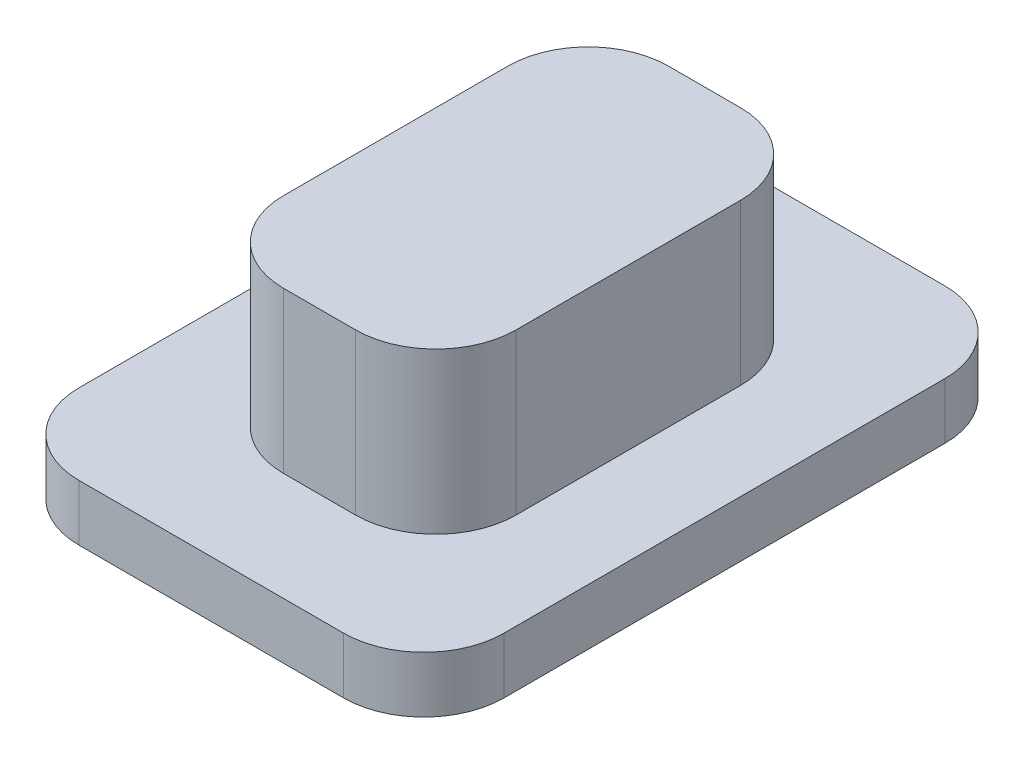
ISO-10303-21;
HEADER;
FILE_DESCRIPTION(('STEP AP214'),'2;1');
FILE_NAME('part.step','',(''),(''),'','','');
FILE_SCHEMA(('AUTOMOTIVE_DESIGN { 1 0 10303 214 1 1 1 1 }'));
ENDSEC;
DATA;
#1=APPLICATION_CONTEXT('core data for automotive mechanical design processes');
#2=APPLICATION_PROTOCOL_DEFINITION('international standard','automotive_design',2000,#1);
#3=PRODUCT_CONTEXT('',#1,'mechanical');
#4=PRODUCT('Part','Part','',(#3));
#5=PRODUCT_RELATED_PRODUCT_CATEGORY('part','',(#4));
#6=PRODUCT_DEFINITION_FORMATION('','',#4);
#7=PRODUCT_DEFINITION_CONTEXT('part definition',#1,'design');
#8=PRODUCT_DEFINITION('design','',#6,#7);
#9=PRODUCT_DEFINITION_SHAPE('','',#8);
#10=(LENGTH_UNIT() NAMED_UNIT(*) SI_UNIT(.MILLI.,.METRE.));
#11=(NAMED_UNIT(*) PLANE_ANGLE_UNIT() SI_UNIT($,.RADIAN.));
#12=(NAMED_UNIT(*) SI_UNIT($,.STERADIAN.) SOLID_ANGLE_UNIT());
#13=UNCERTAINTY_MEASURE_WITH_UNIT(LENGTH_MEASURE(1.E-05),#10,'distance_accuracy_value','');
#14=(GEOMETRIC_REPRESENTATION_CONTEXT(3) GLOBAL_UNCERTAINTY_ASSIGNED_CONTEXT((#13)) GLOBAL_UNIT_ASSIGNED_CONTEXT((#10,
#11,#12)) REPRESENTATION_CONTEXT('',''));
#15=CARTESIAN_POINT('',(0.,0.,0.));
#16=DIRECTION('',(0.,0.,1.));
#17=DIRECTION('',(1.,0.,0.));
#18=AXIS2_PLACEMENT_3D('',#15,#16,#17);
#19=CARTESIAN_POINT('',(0.,0.7,-5.48303571428572));
#20=DIRECTION('',(0.,0.,-1.));
#21=DIRECTION('',(-1.,0.,0.));
#22=AXIS2_PLACEMENT_3D('',#19,#20,#21);
#23=PLANE('',#22);
#24=DIRECTION('',(1.,0.,0.));
#25=VECTOR('',#24,1.);
#26=CARTESIAN_POINT('',(0.,0.,-5.48303571428572));
#27=LINE('',#26,#25);
#28=CARTESIAN_POINT('',(-2.91666666666666,0.,-5.48303571428572));
#29=VERTEX_POINT('',#28);
#30=CARTESIAN_POINT('',(0.383333333333336,0.,-5.48303571428572));
#31=VERTEX_POINT('',#30);
#32=EDGE_CURVE('E147',#29,#31,#27,.T.);
#33=ORIENTED_EDGE('',*,*,#32,.F.);
#34=DIRECTION('',(0.,-1.,0.));
#35=VECTOR('',#34,1.);
#36=CARTESIAN_POINT('',(-2.91666666666666,0.7,-5.48303571428572));
#37=LINE('',#36,#35);
#38=CARTESIAN_POINT('',(-2.91666666666666,0.7,-5.48303571428572));
#39=VERTEX_POINT('',#38);
#40=EDGE_CURVE('E11',#39,#29,#37,.T.);
#41=ORIENTED_EDGE('',*,*,#40,.F.);
#42=DIRECTION('',(1.,0.,0.));
#43=VECTOR('',#42,1.);
#44=CARTESIAN_POINT('',(0.,0.7,-5.48303571428572));
#45=LINE('',#44,#43);
#46=CARTESIAN_POINT('',(0.383333333333336,0.7,-5.48303571428572));
#47=VERTEX_POINT('',#46);
#48=EDGE_CURVE('E191',#39,#47,#45,.T.);
#49=ORIENTED_EDGE('',*,*,#48,.T.);
#50=DIRECTION('',(0.,-1.,0.));
#51=VECTOR('',#50,1.);
#52=CARTESIAN_POINT('',(0.383333333333336,0.7,-5.48303571428572));
#53=LINE('',#52,#51);
#54=EDGE_CURVE('E59',#47,#31,#53,.T.);
#55=ORIENTED_EDGE('',*,*,#54,.T.);
#56=EDGE_LOOP('',(#33,#41,#49,#55));
#57=FACE_BOUND('',#56,.T.);
#58=ADVANCED_FACE('F43',(#57),#23,.T.);
#59=CARTESIAN_POINT('',(-2.91666666666666,0.7,-4.48303571428572));
#60=DIRECTION('',(0.,-1.,0.));
#61=DIRECTION('',(0.,0.,-1.));
#62=AXIS2_PLACEMENT_3D('',#59,#60,#61);
#63=CYLINDRICAL_SURFACE('',#62,1.);
#64=CARTESIAN_POINT('',(-2.91666666666666,0.,-4.48303571428572));
#65=DIRECTION('',(0.,1.,0.));
#66=DIRECTION('',(0.,0.,1.));
#67=AXIS2_PLACEMENT_3D('',#64,#65,#66);
#68=CIRCLE('',#67,1.);
#69=CARTESIAN_POINT('',(-3.91666666666666,0.,-4.48303571428572));
#70=VERTEX_POINT('',#69);
#71=EDGE_CURVE('E149',#29,#70,#68,.T.);
#72=ORIENTED_EDGE('',*,*,#71,.T.);
#73=DIRECTION('',(0.,-1.,0.));
#74=VECTOR('',#73,1.);
#75=CARTESIAN_POINT('',(-3.91666666666666,0.7,-4.48303571428572));
#76=LINE('',#75,#74);
#77=CARTESIAN_POINT('',(-3.91666666666666,0.7,-4.48303571428572));
#78=VERTEX_POINT('',#77);
#79=EDGE_CURVE('E51',#78,#70,#76,.T.);
#80=ORIENTED_EDGE('',*,*,#79,.F.);
#81=CARTESIAN_POINT('',(-2.91666666666666,0.7,-4.48303571428572));
#82=DIRECTION('',(0.,1.,0.));
#83=DIRECTION('',(0.,0.,1.));
#84=AXIS2_PLACEMENT_3D('',#81,#82,#83);
#85=CIRCLE('',#84,1.);
#86=EDGE_CURVE('E192',#39,#78,#85,.T.);
#87=ORIENTED_EDGE('',*,*,#86,.F.);
#88=ORIENTED_EDGE('',*,*,#40,.T.);
#89=EDGE_LOOP('',(#72,#80,#87,#88));
#90=FACE_BOUND('',#89,.T.);
#91=ADVANCED_FACE('F188',(#90),#63,.T.);
#92=CARTESIAN_POINT('',(-3.91666666666666,0.7,0.));
#93=DIRECTION('',(1.,0.,0.));
#94=DIRECTION('',(0.,0.,-1.));
#95=AXIS2_PLACEMENT_3D('',#92,#93,#94);
#96=PLANE('',#95);
#97=DIRECTION('',(0.,0.,1.));
#98=VECTOR('',#97,1.);
#99=CARTESIAN_POINT('',(-3.91666666666666,0.,0.));
#100=LINE('',#99,#98);
#101=CARTESIAN_POINT('',(-3.91666666666666,0.,1.01696428571428));
#102=VERTEX_POINT('',#101);
#103=EDGE_CURVE('E153',#70,#102,#100,.T.);
#104=ORIENTED_EDGE('',*,*,#103,.T.);
#105=DIRECTION('',(0.,-1.,0.));
#106=VECTOR('',#105,1.);
#107=CARTESIAN_POINT('',(-3.91666666666666,0.7,1.01696428571428));
#108=LINE('',#107,#106);
#109=CARTESIAN_POINT('',(-3.91666666666666,0.7,1.01696428571428));
#110=VERTEX_POINT('',#109);
#111=EDGE_CURVE('E175',#110,#102,#108,.T.);
#112=ORIENTED_EDGE('',*,*,#111,.F.);
#113=DIRECTION('',(0.,0.,1.));
#114=VECTOR('',#113,1.);
#115=CARTESIAN_POINT('',(-3.91666666666666,0.7,0.));
#116=LINE('',#115,#114);
#117=EDGE_CURVE('E183',#78,#110,#116,.T.);
#118=ORIENTED_EDGE('',*,*,#117,.F.);
#119=ORIENTED_EDGE('',*,*,#79,.T.);
#120=EDGE_LOOP('',(#104,#112,#118,#119));
#121=FACE_BOUND('',#120,.T.);
#122=ADVANCED_FACE('F180',(#121),#96,.F.);
#123=CARTESIAN_POINT('',(-2.91666666666666,0.7,1.01696428571428));
#124=DIRECTION('',(0.,-1.,0.));
#125=DIRECTION('',(0.,0.,-1.));
#126=AXIS2_PLACEMENT_3D('',#123,#124,#125);
#127=CYLINDRICAL_SURFACE('',#126,1.);
#128=CARTESIAN_POINT('',(-2.91666666666666,0.,1.01696428571428));
#129=DIRECTION('',(0.,1.,0.));
#130=DIRECTION('',(0.,0.,1.));
#131=AXIS2_PLACEMENT_3D('',#128,#129,#130);
#132=CIRCLE('',#131,1.);
#133=CARTESIAN_POINT('',(-2.91666666666666,0.,2.01696428571428));
#134=VERTEX_POINT('',#133);
#135=EDGE_CURVE('E156',#102,#134,#132,.T.);
#136=ORIENTED_EDGE('',*,*,#135,.T.);
#137=DIRECTION('',(0.,-1.,0.));
#138=VECTOR('',#137,1.);
#139=CARTESIAN_POINT('',(-2.91666666666666,0.7,2.01696428571428));
#140=LINE('',#139,#138);
#141=CARTESIAN_POINT('',(-2.91666666666666,0.7,2.01696428571428));
#142=VERTEX_POINT('',#141);
#143=EDGE_CURVE('E172',#142,#134,#140,.T.);
#144=ORIENTED_EDGE('',*,*,#143,.F.);
#145=CARTESIAN_POINT('',(-2.91666666666666,0.7,1.01696428571428));
#146=DIRECTION('',(0.,1.,0.));
#147=DIRECTION('',(0.,0.,1.));
#148=AXIS2_PLACEMENT_3D('',#145,#146,#147);
#149=CIRCLE('',#148,1.);
#150=EDGE_CURVE('E202',#110,#142,#149,.T.);
#151=ORIENTED_EDGE('',*,*,#150,.F.);
#152=ORIENTED_EDGE('',*,*,#111,.T.);
#153=EDGE_LOOP('',(#136,#144,#151,#152));
#154=FACE_BOUND('',#153,.T.);
#155=ADVANCED_FACE('F205',(#154),#127,.T.);
#156=CARTESIAN_POINT('',(0.,0.7,2.01696428571428));
#157=DIRECTION('',(0.,0.,-1.));
#158=DIRECTION('',(-1.,0.,0.));
#159=AXIS2_PLACEMENT_3D('',#156,#157,#158);
#160=PLANE('',#159);
#161=DIRECTION('',(1.,0.,0.));
#162=VECTOR('',#161,1.);
#163=CARTESIAN_POINT('',(0.,0.,2.01696428571428));
#164=LINE('',#163,#162);
#165=CARTESIAN_POINT('',(0.383333333333338,0.,2.01696428571428));
#166=VERTEX_POINT('',#165);
#167=EDGE_CURVE('E159',#134,#166,#164,.T.);
#168=ORIENTED_EDGE('',*,*,#167,.T.);
#169=DIRECTION('',(0.,-1.,0.));
#170=VECTOR('',#169,1.);
#171=CARTESIAN_POINT('',(0.383333333333338,0.7,2.01696428571428));
#172=LINE('',#171,#170);
#173=CARTESIAN_POINT('',(0.383333333333338,0.7,2.01696428571428));
#174=VERTEX_POINT('',#173);
#175=EDGE_CURVE('E139',#174,#166,#172,.T.);
#176=ORIENTED_EDGE('',*,*,#175,.F.);
#177=DIRECTION('',(1.,0.,0.));
#178=VECTOR('',#177,1.);
#179=CARTESIAN_POINT('',(0.,0.7,2.01696428571428));
#180=LINE('',#179,#178);
#181=EDGE_CURVE('E128',#142,#174,#180,.T.);
#182=ORIENTED_EDGE('',*,*,#181,.F.);
#183=ORIENTED_EDGE('',*,*,#143,.T.);
#184=EDGE_LOOP('',(#168,#176,#182,#183));
#185=FACE_BOUND('',#184,.T.);
#186=ADVANCED_FACE('F207',(#185),#160,.F.);
#187=CARTESIAN_POINT('',(0.383333333333338,0.7,1.01696428571428));
#188=DIRECTION('',(0.,-1.,0.));
#189=DIRECTION('',(0.,0.,-1.));
#190=AXIS2_PLACEMENT_3D('',#187,#188,#189);
#191=CYLINDRICAL_SURFACE('',#190,1.);
#192=CARTESIAN_POINT('',(0.383333333333338,0.,1.01696428571428));
#193=DIRECTION('',(0.,1.,0.));
#194=DIRECTION('',(0.,0.,1.));
#195=AXIS2_PLACEMENT_3D('',#192,#193,#194);
#196=CIRCLE('',#195,1.);
#197=CARTESIAN_POINT('',(1.38333333333334,0.,1.01696428571428));
#198=VERTEX_POINT('',#197);
#199=EDGE_CURVE('E136',#166,#198,#196,.T.);
#200=ORIENTED_EDGE('',*,*,#199,.T.);
#201=DIRECTION('',(0.,-1.,0.));
#202=VECTOR('',#201,1.);
#203=CARTESIAN_POINT('',(1.38333333333334,0.7,1.01696428571428));
#204=LINE('',#203,#202);
#205=CARTESIAN_POINT('',(1.38333333333334,0.7,1.01696428571428));
#206=VERTEX_POINT('',#205);
#207=EDGE_CURVE('E134',#206,#198,#204,.T.);
#208=ORIENTED_EDGE('',*,*,#207,.F.);
#209=CARTESIAN_POINT('',(0.383333333333338,0.7,1.01696428571428));
#210=DIRECTION('',(0.,1.,0.));
#211=DIRECTION('',(0.,0.,1.));
#212=AXIS2_PLACEMENT_3D('',#209,#210,#211);
#213=CIRCLE('',#212,1.);
#214=EDGE_CURVE('E120',#174,#206,#213,.T.);
#215=ORIENTED_EDGE('',*,*,#214,.F.);
#216=ORIENTED_EDGE('',*,*,#175,.T.);
#217=EDGE_LOOP('',(#200,#208,#215,#216));
#218=FACE_BOUND('',#217,.T.);
#219=ADVANCED_FACE('F135',(#218),#191,.T.);
#220=CARTESIAN_POINT('',(1.38333333333334,0.7,0.));
#221=DIRECTION('',(1.,0.,0.));
#222=DIRECTION('',(0.,0.,-1.));
#223=AXIS2_PLACEMENT_3D('',#220,#221,#222);
#224=PLANE('',#223);
#225=DIRECTION('',(0.,0.,1.));
#226=VECTOR('',#225,1.);
#227=CARTESIAN_POINT('',(1.38333333333334,0.,0.));
#228=LINE('',#227,#226);
#229=CARTESIAN_POINT('',(1.38333333333334,0.,-4.48303571428572));
#230=VERTEX_POINT('',#229);
#231=EDGE_CURVE('E163',#230,#198,#228,.T.);
#232=ORIENTED_EDGE('',*,*,#231,.F.);
#233=DIRECTION('',(0.,-1.,0.));
#234=VECTOR('',#233,1.);
#235=CARTESIAN_POINT('',(1.38333333333334,0.7,-4.48303571428572));
#236=LINE('',#235,#234);
#237=CARTESIAN_POINT('',(1.38333333333334,0.7,-4.48303571428572));
#238=VERTEX_POINT('',#237);
#239=EDGE_CURVE('E85',#238,#230,#236,.T.);
#240=ORIENTED_EDGE('',*,*,#239,.F.);
#241=DIRECTION('',(0.,0.,1.));
#242=VECTOR('',#241,1.);
#243=CARTESIAN_POINT('',(1.38333333333334,0.7,0.));
#244=LINE('',#243,#242);
#245=EDGE_CURVE('E126',#238,#206,#244,.T.);
#246=ORIENTED_EDGE('',*,*,#245,.T.);
#247=ORIENTED_EDGE('',*,*,#207,.T.);
#248=EDGE_LOOP('',(#232,#240,#246,#247));
#249=FACE_BOUND('',#248,.T.);
#250=ADVANCED_FACE('F141',(#249),#224,.T.);
#251=CARTESIAN_POINT('',(0.383333333333336,0.7,-4.48303571428572));
#252=DIRECTION('',(0.,-1.,0.));
#253=DIRECTION('',(0.,0.,-1.));
#254=AXIS2_PLACEMENT_3D('',#251,#252,#253);
#255=CYLINDRICAL_SURFACE('',#254,1.);
#256=CARTESIAN_POINT('',(0.383333333333336,0.,-4.48303571428572));
#257=DIRECTION('',(0.,1.,0.));
#258=DIRECTION('',(0.,0.,1.));
#259=AXIS2_PLACEMENT_3D('',#256,#257,#258);
#260=CIRCLE('',#259,1.);
#261=EDGE_CURVE('E165',#31,#230,#260,.F.);
#262=ORIENTED_EDGE('',*,*,#261,.F.);
#263=ORIENTED_EDGE('',*,*,#54,.F.);
#264=CARTESIAN_POINT('',(0.383333333333336,0.7,-4.48303571428572));
#265=DIRECTION('',(0.,1.,0.));
#266=DIRECTION('',(0.,0.,1.));
#267=AXIS2_PLACEMENT_3D('',#264,#265,#266);
#268=CIRCLE('',#267,1.);
#269=EDGE_CURVE('E142',#47,#238,#268,.F.);
#270=ORIENTED_EDGE('',*,*,#269,.T.);
#271=ORIENTED_EDGE('',*,*,#239,.T.);
#272=EDGE_LOOP('',(#262,#263,#270,#271));
#273=FACE_BOUND('',#272,.T.);
#274=ADVANCED_FACE('F208',(#273),#255,.T.);
#275=CARTESIAN_POINT('',(0.,0.7,0.));
#276=DIRECTION('',(0.,1.,0.));
#277=DIRECTION('',(0.,0.,1.));
#278=AXIS2_PLACEMENT_3D('',#275,#276,#277);
#279=PLANE('',#278);
#280=CARTESIAN_POINT('',(-1.71666666666667,0.7,-3.13303571428572));
#281=DIRECTION('',(0.,1.,0.));
#282=DIRECTION('',(0.,0.,1.));
#283=AXIS2_PLACEMENT_3D('',#280,#281,#282);
#284=CIRCLE('',#283,1.);
#285=CARTESIAN_POINT('',(-1.71666666666667,0.700000000000001,-4.13303571428572));
#286=VERTEX_POINT('',#285);
#287=CARTESIAN_POINT('',(-2.71666666666667,0.700000000000001,-3.13303571428572));
#288=VERTEX_POINT('',#287);
#289=EDGE_CURVE('E168',#286,#288,#284,.T.);
#290=ORIENTED_EDGE('',*,*,#289,.F.);
#291=DIRECTION('',(1.,0.,0.));
#292=VECTOR('',#291,1.);
#293=CARTESIAN_POINT('',(0.,0.7,-4.13303571428572));
#294=LINE('',#293,#292);
#295=CARTESIAN_POINT('',(-0.816666666666672,0.700000000000001,-4.13303571428572));
#296=VERTEX_POINT('',#295);
#297=EDGE_CURVE('E412',#286,#296,#294,.T.);
#298=ORIENTED_EDGE('',*,*,#297,.T.);
#299=CARTESIAN_POINT('',(-0.816666666666665,0.7,-3.13303571428572));
#300=DIRECTION('',(0.,1.,0.));
#301=DIRECTION('',(0.,0.,1.));
#302=AXIS2_PLACEMENT_3D('',#299,#300,#301);
#303=CIRCLE('',#302,1.);
#304=CARTESIAN_POINT('',(0.183333333333335,0.7,-3.13303571428571));
#305=VERTEX_POINT('',#304);
#306=EDGE_CURVE('E415',#296,#305,#303,.F.);
#307=ORIENTED_EDGE('',*,*,#306,.T.);
#308=DIRECTION('',(0.,0.,1.));
#309=VECTOR('',#308,1.);
#310=CARTESIAN_POINT('',(0.183333333333336,0.7,0.));
#311=LINE('',#310,#309);
#312=CARTESIAN_POINT('',(0.183333333333336,0.700000000000001,-0.333035714285717));
#313=VERTEX_POINT('',#312);
#314=EDGE_CURVE('E418',#305,#313,#311,.T.);
#315=ORIENTED_EDGE('',*,*,#314,.T.);
#316=CARTESIAN_POINT('',(-0.816666666666664,0.7,-0.333035714285716));
#317=DIRECTION('',(0.,1.,0.));
#318=DIRECTION('',(0.,0.,1.));
#319=AXIS2_PLACEMENT_3D('',#316,#317,#318);
#320=CIRCLE('',#319,1.);
#321=CARTESIAN_POINT('',(-0.816666666666664,0.700000000000001,0.666964285714284));
#322=VERTEX_POINT('',#321);
#323=EDGE_CURVE('E421',#322,#313,#320,.T.);
#324=ORIENTED_EDGE('',*,*,#323,.F.);
#325=DIRECTION('',(1.,0.,0.));
#326=VECTOR('',#325,1.);
#327=CARTESIAN_POINT('',(0.,0.7,0.666964285714284));
#328=LINE('',#327,#326);
#329=CARTESIAN_POINT('',(-1.71666666666666,0.700000000000001,0.666964285714284));
#330=VERTEX_POINT('',#329);
#331=EDGE_CURVE('E424',#330,#322,#328,.T.);
#332=ORIENTED_EDGE('',*,*,#331,.F.);
#333=CARTESIAN_POINT('',(-1.71666666666666,0.7,-0.333035714285716));
#334=DIRECTION('',(0.,1.,0.));
#335=DIRECTION('',(0.,0.,1.));
#336=AXIS2_PLACEMENT_3D('',#333,#334,#335);
#337=CIRCLE('',#336,1.);
#338=CARTESIAN_POINT('',(-2.71666666666666,0.700000000000001,-0.333035714285716));
#339=VERTEX_POINT('',#338);
#340=EDGE_CURVE('E197',#339,#330,#337,.T.);
#341=ORIENTED_EDGE('',*,*,#340,.F.);
#342=DIRECTION('',(0.,0.,1.));
#343=VECTOR('',#342,1.);
#344=CARTESIAN_POINT('',(-2.71666666666666,0.7,0.));
#345=LINE('',#344,#343);
#346=EDGE_CURVE('E194',#288,#339,#345,.T.);
#347=ORIENTED_EDGE('',*,*,#346,.F.);
#348=EDGE_LOOP('',(#290,#298,#307,#315,#324,#332,#341,#347));
#349=FACE_BOUND('',#348,.T.);
#350=ORIENTED_EDGE('',*,*,#48,.F.);
#351=ORIENTED_EDGE('',*,*,#86,.T.);
#352=ORIENTED_EDGE('',*,*,#117,.T.);
#353=ORIENTED_EDGE('',*,*,#150,.T.);
#354=ORIENTED_EDGE('',*,*,#181,.T.);
#355=ORIENTED_EDGE('',*,*,#214,.T.);
#356=ORIENTED_EDGE('',*,*,#245,.F.);
#357=ORIENTED_EDGE('',*,*,#269,.F.);
#358=EDGE_LOOP('',(#350,#351,#352,#353,#354,#355,#356,#357));
#359=FACE_BOUND('',#358,.T.);
#360=ADVANCED_FACE('F123',(#349,#359),#279,.T.);
#361=CARTESIAN_POINT('',(0.,0.,0.));
#362=DIRECTION('',(0.,1.,0.));
#363=DIRECTION('',(0.,0.,1.));
#364=AXIS2_PLACEMENT_3D('',#361,#362,#363);
#365=PLANE('',#364);
#366=ORIENTED_EDGE('',*,*,#32,.T.);
#367=ORIENTED_EDGE('',*,*,#261,.T.);
#368=ORIENTED_EDGE('',*,*,#231,.T.);
#369=ORIENTED_EDGE('',*,*,#199,.F.);
#370=ORIENTED_EDGE('',*,*,#167,.F.);
#371=ORIENTED_EDGE('',*,*,#135,.F.);
#372=ORIENTED_EDGE('',*,*,#103,.F.);
#373=ORIENTED_EDGE('',*,*,#71,.F.);
#374=EDGE_LOOP('',(#366,#367,#368,#369,#370,#371,#372,#373));
#375=FACE_BOUND('',#374,.T.);
#376=ADVANCED_FACE('F190',(#375),#365,.F.);
#377=CARTESIAN_POINT('',(0.,2.7,-4.13303571428572));
#378=DIRECTION('',(0.,0.,-1.));
#379=DIRECTION('',(-1.,0.,0.));
#380=AXIS2_PLACEMENT_3D('',#377,#378,#379);
#381=PLANE('',#380);
#382=DIRECTION('',(0.,-1.,0.));
#383=VECTOR('',#382,1.);
#384=CARTESIAN_POINT('',(-0.816666666666672,2.7,-4.13303571428572));
#385=LINE('',#384,#383);
#386=CARTESIAN_POINT('',(-0.816666666666672,2.7,-4.13303571428572));
#387=VERTEX_POINT('',#386);
#388=EDGE_CURVE('E390',#387,#296,#385,.T.);
#389=ORIENTED_EDGE('',*,*,#388,.T.);
#390=ORIENTED_EDGE('',*,*,#297,.F.);
#391=DIRECTION('',(0.,-1.,0.));
#392=VECTOR('',#391,1.);
#393=CARTESIAN_POINT('',(-1.71666666666667,2.7,-4.13303571428572));
#394=LINE('',#393,#392);
#395=CARTESIAN_POINT('',(-1.71666666666667,2.7,-4.13303571428572));
#396=VERTEX_POINT('',#395);
#397=EDGE_CURVE('E150',#396,#286,#394,.T.);
#398=ORIENTED_EDGE('',*,*,#397,.F.);
#399=DIRECTION('',(1.,0.,0.));
#400=VECTOR('',#399,1.);
#401=CARTESIAN_POINT('',(0.,2.7,-4.13303571428572));
#402=LINE('',#401,#400);
#403=EDGE_CURVE('E360',#396,#387,#402,.T.);
#404=ORIENTED_EDGE('',*,*,#403,.T.);
#405=EDGE_LOOP('',(#389,#390,#398,#404));
#406=FACE_BOUND('',#405,.T.);
#407=ADVANCED_FACE('F262',(#406),#381,.T.);
#408=CARTESIAN_POINT('',(-1.71666666666667,2.7,-3.13303571428572));
#409=DIRECTION('',(0.,-1.,0.));
#410=DIRECTION('',(0.,0.,-1.));
#411=AXIS2_PLACEMENT_3D('',#408,#409,#410);
#412=CYLINDRICAL_SURFACE('',#411,1.);
#413=ORIENTED_EDGE('',*,*,#289,.T.);
#414=DIRECTION('',(0.,-1.,0.));
#415=VECTOR('',#414,1.);
#416=CARTESIAN_POINT('',(-2.71666666666667,2.7,-3.13303571428572));
#417=LINE('',#416,#415);
#418=CARTESIAN_POINT('',(-2.71666666666667,2.7,-3.13303571428572));
#419=VERTEX_POINT('',#418);
#420=EDGE_CURVE('E405',#419,#288,#417,.T.);
#421=ORIENTED_EDGE('',*,*,#420,.F.);
#422=CARTESIAN_POINT('',(-1.71666666666667,2.7,-3.13303571428572));
#423=DIRECTION('',(0.,1.,0.));
#424=DIRECTION('',(0.,0.,1.));
#425=AXIS2_PLACEMENT_3D('',#422,#423,#424);
#426=CIRCLE('',#425,1.);
#427=EDGE_CURVE('E364',#396,#419,#426,.T.);
#428=ORIENTED_EDGE('',*,*,#427,.F.);
#429=ORIENTED_EDGE('',*,*,#397,.T.);
#430=EDGE_LOOP('',(#413,#421,#428,#429));
#431=FACE_BOUND('',#430,.T.);
#432=ADVANCED_FACE('F273',(#431),#412,.T.);
#433=CARTESIAN_POINT('',(-2.71666666666666,2.7,0.));
#434=DIRECTION('',(1.,0.,0.));
#435=DIRECTION('',(0.,0.,-1.));
#436=AXIS2_PLACEMENT_3D('',#433,#434,#435);
#437=PLANE('',#436);
#438=ORIENTED_EDGE('',*,*,#346,.T.);
#439=DIRECTION('',(0.,-1.,0.));
#440=VECTOR('',#439,1.);
#441=CARTESIAN_POINT('',(-2.71666666666666,2.7,-0.333035714285716));
#442=LINE('',#441,#440);
#443=CARTESIAN_POINT('',(-2.71666666666666,2.7,-0.333035714285716));
#444=VERTEX_POINT('',#443);
#445=EDGE_CURVE('E402',#444,#339,#442,.T.);
#446=ORIENTED_EDGE('',*,*,#445,.F.);
#447=DIRECTION('',(0.,0.,1.));
#448=VECTOR('',#447,1.);
#449=CARTESIAN_POINT('',(-2.71666666666666,2.7,0.));
#450=LINE('',#449,#448);
#451=EDGE_CURVE('E373',#419,#444,#450,.T.);
#452=ORIENTED_EDGE('',*,*,#451,.F.);
#453=ORIENTED_EDGE('',*,*,#420,.T.);
#454=EDGE_LOOP('',(#438,#446,#452,#453));
#455=FACE_BOUND('',#454,.T.);
#456=ADVANCED_FACE('F283',(#455),#437,.F.);
#457=CARTESIAN_POINT('',(-1.71666666666666,2.7,-0.333035714285716));
#458=DIRECTION('',(0.,-1.,0.));
#459=DIRECTION('',(0.,0.,-1.));
#460=AXIS2_PLACEMENT_3D('',#457,#458,#459);
#461=CYLINDRICAL_SURFACE('',#460,1.);
#462=ORIENTED_EDGE('',*,*,#340,.T.);
#463=DIRECTION('',(0.,-1.,0.));
#464=VECTOR('',#463,1.);
#465=CARTESIAN_POINT('',(-1.71666666666666,2.7,0.666964285714284));
#466=LINE('',#465,#464);
#467=CARTESIAN_POINT('',(-1.71666666666666,2.7,0.666964285714284));
#468=VERTEX_POINT('',#467);
#469=EDGE_CURVE('E399',#468,#330,#466,.T.);
#470=ORIENTED_EDGE('',*,*,#469,.F.);
#471=CARTESIAN_POINT('',(-1.71666666666666,2.7,-0.333035714285716));
#472=DIRECTION('',(0.,1.,0.));
#473=DIRECTION('',(0.,0.,1.));
#474=AXIS2_PLACEMENT_3D('',#471,#472,#473);
#475=CIRCLE('',#474,1.);
#476=EDGE_CURVE('E377',#444,#468,#475,.T.);
#477=ORIENTED_EDGE('',*,*,#476,.F.);
#478=ORIENTED_EDGE('',*,*,#445,.T.);
#479=EDGE_LOOP('',(#462,#470,#477,#478));
#480=FACE_BOUND('',#479,.T.);
#481=ADVANCED_FACE('F293',(#480),#461,.T.);
#482=CARTESIAN_POINT('',(0.,2.7,0.666964285714284));
#483=DIRECTION('',(0.,0.,-1.));
#484=DIRECTION('',(-1.,0.,0.));
#485=AXIS2_PLACEMENT_3D('',#482,#483,#484);
#486=PLANE('',#485);
#487=ORIENTED_EDGE('',*,*,#331,.T.);
#488=DIRECTION('',(0.,-1.,0.));
#489=VECTOR('',#488,1.);
#490=CARTESIAN_POINT('',(-0.816666666666664,2.7,0.666964285714284));
#491=LINE('',#490,#489);
#492=CARTESIAN_POINT('',(-0.816666666666664,2.7,0.666964285714284));
#493=VERTEX_POINT('',#492);
#494=EDGE_CURVE('E396',#493,#322,#491,.T.);
#495=ORIENTED_EDGE('',*,*,#494,.F.);
#496=DIRECTION('',(1.,0.,0.));
#497=VECTOR('',#496,1.);
#498=CARTESIAN_POINT('',(0.,2.7,0.666964285714284));
#499=LINE('',#498,#497);
#500=EDGE_CURVE('E380',#468,#493,#499,.T.);
#501=ORIENTED_EDGE('',*,*,#500,.F.);
#502=ORIENTED_EDGE('',*,*,#469,.T.);
#503=EDGE_LOOP('',(#487,#495,#501,#502));
#504=FACE_BOUND('',#503,.T.);
#505=ADVANCED_FACE('F303',(#504),#486,.F.);
#506=CARTESIAN_POINT('',(-0.816666666666664,2.7,-0.333035714285716));
#507=DIRECTION('',(0.,-1.,0.));
#508=DIRECTION('',(0.,0.,-1.));
#509=AXIS2_PLACEMENT_3D('',#506,#507,#508);
#510=CYLINDRICAL_SURFACE('',#509,1.);
#511=ORIENTED_EDGE('',*,*,#323,.T.);
#512=DIRECTION('',(0.,-1.,0.));
#513=VECTOR('',#512,1.);
#514=CARTESIAN_POINT('',(0.183333333333336,2.7,-0.333035714285717));
#515=LINE('',#514,#513);
#516=CARTESIAN_POINT('',(0.183333333333336,2.7,-0.333035714285717));
#517=VERTEX_POINT('',#516);
#518=EDGE_CURVE('E393',#517,#313,#515,.T.);
#519=ORIENTED_EDGE('',*,*,#518,.F.);
#520=CARTESIAN_POINT('',(-0.816666666666664,2.7,-0.333035714285716));
#521=DIRECTION('',(0.,1.,0.));
#522=DIRECTION('',(0.,0.,1.));
#523=AXIS2_PLACEMENT_3D('',#520,#521,#522);
#524=CIRCLE('',#523,1.);
#525=EDGE_CURVE('E383',#493,#517,#524,.T.);
#526=ORIENTED_EDGE('',*,*,#525,.F.);
#527=ORIENTED_EDGE('',*,*,#494,.T.);
#528=EDGE_LOOP('',(#511,#519,#526,#527));
#529=FACE_BOUND('',#528,.T.);
#530=ADVANCED_FACE('F313',(#529),#510,.T.);
#531=CARTESIAN_POINT('',(0.183333333333336,2.7,0.));
#532=DIRECTION('',(1.,0.,0.));
#533=DIRECTION('',(0.,0.,-1.));
#534=AXIS2_PLACEMENT_3D('',#531,#532,#533);
#535=PLANE('',#534);
#536=ORIENTED_EDGE('',*,*,#518,.T.);
#537=ORIENTED_EDGE('',*,*,#314,.F.);
#538=DIRECTION('',(0.,-1.,0.));
#539=VECTOR('',#538,1.);
#540=CARTESIAN_POINT('',(0.183333333333335,2.7,-3.13303571428571));
#541=LINE('',#540,#539);
#542=CARTESIAN_POINT('',(0.183333333333335,2.7,-3.13303571428571));
#543=VERTEX_POINT('',#542);
#544=EDGE_CURVE('E98',#543,#305,#541,.T.);
#545=ORIENTED_EDGE('',*,*,#544,.F.);
#546=DIRECTION('',(0.,0.,1.));
#547=VECTOR('',#546,1.);
#548=CARTESIAN_POINT('',(0.183333333333336,2.7,0.));
#549=LINE('',#548,#547);
#550=EDGE_CURVE('E386',#543,#517,#549,.T.);
#551=ORIENTED_EDGE('',*,*,#550,.T.);
#552=EDGE_LOOP('',(#536,#537,#545,#551));
#553=FACE_BOUND('',#552,.T.);
#554=ADVANCED_FACE('F323',(#553),#535,.T.);
#555=CARTESIAN_POINT('',(-0.816666666666665,2.7,-3.13303571428572));
#556=DIRECTION('',(0.,-1.,0.));
#557=DIRECTION('',(0.,0.,-1.));
#558=AXIS2_PLACEMENT_3D('',#555,#556,#557);
#559=CYLINDRICAL_SURFACE('',#558,1.);
#560=ORIENTED_EDGE('',*,*,#544,.T.);
#561=ORIENTED_EDGE('',*,*,#306,.F.);
#562=ORIENTED_EDGE('',*,*,#388,.F.);
#563=CARTESIAN_POINT('',(-0.816666666666665,2.7,-3.13303571428572));
#564=DIRECTION('',(0.,1.,0.));
#565=DIRECTION('',(0.,0.,1.));
#566=AXIS2_PLACEMENT_3D('',#563,#564,#565);
#567=CIRCLE('',#566,1.);
#568=EDGE_CURVE('E368',#387,#543,#567,.F.);
#569=ORIENTED_EDGE('',*,*,#568,.T.);
#570=EDGE_LOOP('',(#560,#561,#562,#569));
#571=FACE_BOUND('',#570,.T.);
#572=ADVANCED_FACE('F333',(#571),#559,.T.);
#573=CARTESIAN_POINT('',(0.,2.7,0.));
#574=DIRECTION('',(0.,1.,0.));
#575=DIRECTION('',(0.,0.,1.));
#576=AXIS2_PLACEMENT_3D('',#573,#574,#575);
#577=PLANE('',#576);
#578=ORIENTED_EDGE('',*,*,#403,.F.);
#579=ORIENTED_EDGE('',*,*,#427,.T.);
#580=ORIENTED_EDGE('',*,*,#451,.T.);
#581=ORIENTED_EDGE('',*,*,#476,.T.);
#582=ORIENTED_EDGE('',*,*,#500,.T.);
#583=ORIENTED_EDGE('',*,*,#525,.T.);
#584=ORIENTED_EDGE('',*,*,#550,.F.);
#585=ORIENTED_EDGE('',*,*,#568,.F.);
#586=EDGE_LOOP('',(#578,#579,#580,#581,#582,#583,#584,#585));
#587=FACE_BOUND('',#586,.T.);
#588=ADVANCED_FACE('F343',(#587),#577,.T.);
#589=CLOSED_SHELL('',(#58,#91,#122,#155,#186,#219,#250,#274,#360,#376,#407,#432,#456,#481,#505,
#530,#554,#572,#588));
#590=MANIFOLD_SOLID_BREP('B2',#589);
#591=ADVANCED_BREP_SHAPE_REPRESENTATION('',(#18,#590),#14);
#592=SHAPE_DEFINITION_REPRESENTATION(#9,#591);
ENDSEC;
END-ISO-10303-21;
